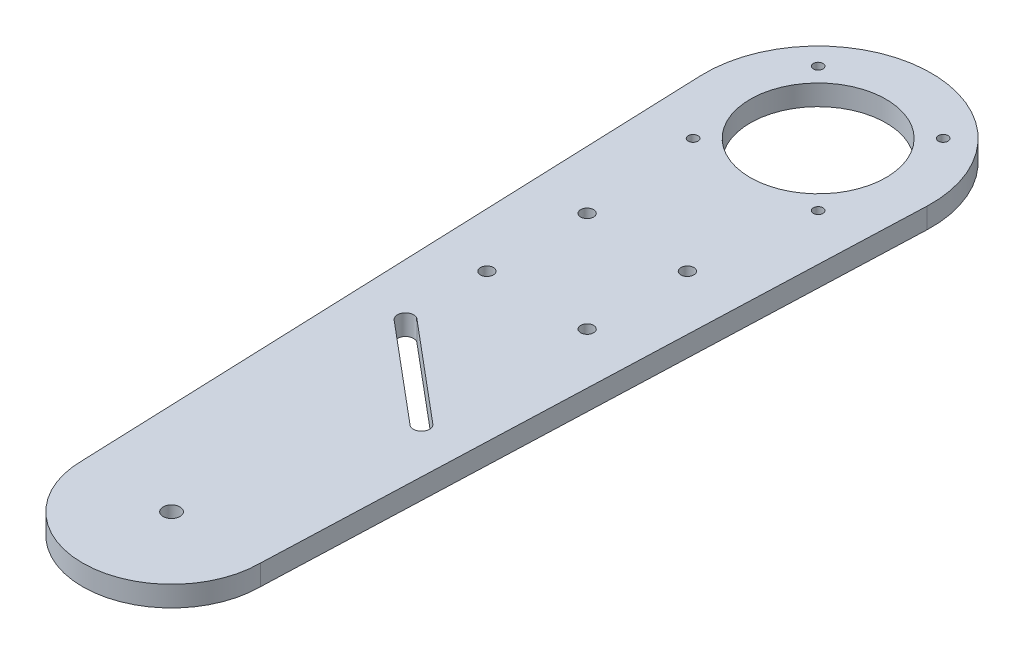
ISO-10303-21;
HEADER;
FILE_DESCRIPTION(('STEP AP214'),'2;1');
FILE_NAME('part.step','',(''),(''),'','','');
FILE_SCHEMA(('AUTOMOTIVE_DESIGN { 1 0 10303 214 1 1 1 1 }'));
ENDSEC;
DATA;
#1=APPLICATION_CONTEXT('core data for automotive mechanical design processes');
#2=APPLICATION_PROTOCOL_DEFINITION('international standard','automotive_design',2000,#1);
#3=PRODUCT_CONTEXT('',#1,'mechanical');
#4=PRODUCT('Part','Part','',(#3));
#5=PRODUCT_RELATED_PRODUCT_CATEGORY('part','',(#4));
#6=PRODUCT_DEFINITION_FORMATION('','',#4);
#7=PRODUCT_DEFINITION_CONTEXT('part definition',#1,'design');
#8=PRODUCT_DEFINITION('design','',#6,#7);
#9=PRODUCT_DEFINITION_SHAPE('','',#8);
#10=(LENGTH_UNIT() NAMED_UNIT(*) SI_UNIT(.MILLI.,.METRE.));
#11=(NAMED_UNIT(*) PLANE_ANGLE_UNIT() SI_UNIT($,.RADIAN.));
#12=(NAMED_UNIT(*) SI_UNIT($,.STERADIAN.) SOLID_ANGLE_UNIT());
#13=UNCERTAINTY_MEASURE_WITH_UNIT(LENGTH_MEASURE(1.E-05),#10,'distance_accuracy_value','');
#14=(GEOMETRIC_REPRESENTATION_CONTEXT(3) GLOBAL_UNCERTAINTY_ASSIGNED_CONTEXT((#13)) GLOBAL_UNIT_ASSIGNED_CONTEXT((#10,
#11,#12)) REPRESENTATION_CONTEXT('',''));
#15=CARTESIAN_POINT('',(0.,0.,0.));
#16=DIRECTION('',(0.,0.,1.));
#17=DIRECTION('',(1.,0.,0.));
#18=AXIS2_PLACEMENT_3D('',#15,#16,#17);
#19=CARTESIAN_POINT('',(27.4611273571522,6.35,1.03319242929476));
#20=DIRECTION('',(-0.999292974733131,0.,-0.0375972159741946));
#21=DIRECTION('',(-0.0375972159741946,0.,0.999292974733131));
#22=AXIS2_PLACEMENT_3D('',#19,#20,#21);
#23=PLANE('',#22);
#24=DIRECTION('',(0.0375972159741946,0.,-0.999292974733131));
#25=VECTOR('',#24,1.);
#26=CARTESIAN_POINT('',(27.4611273571522,0.,1.03319242929476));
#27=LINE('',#26,#25);
#28=CARTESIAN_POINT('',(27.5,0.,0.));
#29=VERTEX_POINT('',#28);
#30=CARTESIAN_POINT('',(34.9752541156596,0.,-198.684097440903));
#31=VERTEX_POINT('',#30);
#32=EDGE_CURVE('E175',#29,#31,#27,.T.);
#33=ORIENTED_EDGE('',*,*,#32,.T.);
#34=DIRECTION('',(0.,-1.,0.));
#35=VECTOR('',#34,1.);
#36=CARTESIAN_POINT('',(34.9752541156596,6.35,-198.684097440903));
#37=LINE('',#36,#35);
#38=CARTESIAN_POINT('',(34.9752541156596,6.35,-198.684097440903));
#39=VERTEX_POINT('',#38);
#40=EDGE_CURVE('E11',#39,#31,#37,.T.);
#41=ORIENTED_EDGE('',*,*,#40,.F.);
#42=DIRECTION('',(0.0375972159741946,0.,-0.999292974733131));
#43=VECTOR('',#42,1.);
#44=CARTESIAN_POINT('',(27.4611273571522,6.35,1.03319242929476));
#45=LINE('',#44,#43);
#46=CARTESIAN_POINT('',(27.5,6.35,0.));
#47=VERTEX_POINT('',#46);
#48=EDGE_CURVE('E178',#47,#39,#45,.T.);
#49=ORIENTED_EDGE('',*,*,#48,.F.);
#50=DIRECTION('',(0.,-1.,0.));
#51=VECTOR('',#50,1.);
#52=CARTESIAN_POINT('',(27.5,6.35,0.));
#53=LINE('',#52,#51);
#54=EDGE_CURVE('E189',#47,#29,#53,.T.);
#55=ORIENTED_EDGE('',*,*,#54,.T.);
#56=EDGE_LOOP('',(#33,#41,#49,#55));
#57=FACE_BOUND('',#56,.T.);
#58=ADVANCED_FACE('F37',(#57),#23,.F.);
#59=CARTESIAN_POINT('',(0.,6.35,-200.));
#60=DIRECTION('',(0.,-1.,0.));
#61=DIRECTION('',(0.,0.,-1.));
#62=AXIS2_PLACEMENT_3D('',#59,#60,#61);
#63=CYLINDRICAL_SURFACE('',#62,35.);
#64=CARTESIAN_POINT('',(0.,0.,-200.));
#65=DIRECTION('',(0.,1.,0.));
#66=DIRECTION('',(0.,0.,1.));
#67=AXIS2_PLACEMENT_3D('',#64,#65,#66);
#68=CIRCLE('',#67,35.);
#69=CARTESIAN_POINT('',(-34.9752541156596,0.,-198.684097440903));
#70=VERTEX_POINT('',#69);
#71=EDGE_CURVE('E192',#31,#70,#68,.T.);
#72=ORIENTED_EDGE('',*,*,#71,.T.);
#73=DIRECTION('',(0.,-1.,0.));
#74=VECTOR('',#73,1.);
#75=CARTESIAN_POINT('',(-34.9752541156596,6.35,-198.684097440903));
#76=LINE('',#75,#74);
#77=CARTESIAN_POINT('',(-34.9752541156596,6.35,-198.684097440903));
#78=VERTEX_POINT('',#77);
#79=EDGE_CURVE('E44',#78,#70,#76,.T.);
#80=ORIENTED_EDGE('',*,*,#79,.F.);
#81=CARTESIAN_POINT('',(0.,6.35,-200.));
#82=DIRECTION('',(0.,1.,0.));
#83=DIRECTION('',(0.,0.,1.));
#84=AXIS2_PLACEMENT_3D('',#81,#82,#83);
#85=CIRCLE('',#84,35.);
#86=EDGE_CURVE('E181',#39,#78,#85,.T.);
#87=ORIENTED_EDGE('',*,*,#86,.F.);
#88=ORIENTED_EDGE('',*,*,#40,.T.);
#89=EDGE_LOOP('',(#72,#80,#87,#88));
#90=FACE_BOUND('',#89,.T.);
#91=ADVANCED_FACE('F208',(#90),#63,.T.);
#92=CARTESIAN_POINT('',(-27.4611273571522,6.35,1.03319242929476));
#93=DIRECTION('',(-0.999292974733131,0.,0.0375972159741946));
#94=DIRECTION('',(0.0375972159741946,0.,0.999292974733131));
#95=AXIS2_PLACEMENT_3D('',#92,#93,#94);
#96=PLANE('',#95);
#97=DIRECTION('',(-0.0375972159741946,0.,-0.999292974733131));
#98=VECTOR('',#97,1.);
#99=CARTESIAN_POINT('',(-27.4611273571522,0.,1.03319242929476));
#100=LINE('',#99,#98);
#101=CARTESIAN_POINT('',(-27.5,0.,0.));
#102=VERTEX_POINT('',#101);
#103=EDGE_CURVE('E195',#102,#70,#100,.T.);
#104=ORIENTED_EDGE('',*,*,#103,.F.);
#105=DIRECTION('',(0.,-1.,0.));
#106=VECTOR('',#105,1.);
#107=CARTESIAN_POINT('',(-27.5,6.35,0.));
#108=LINE('',#107,#106);
#109=CARTESIAN_POINT('',(-27.5,6.35,0.));
#110=VERTEX_POINT('',#109);
#111=EDGE_CURVE('E201',#110,#102,#108,.T.);
#112=ORIENTED_EDGE('',*,*,#111,.F.);
#113=DIRECTION('',(-0.0375972159741946,0.,-0.999292974733131));
#114=VECTOR('',#113,1.);
#115=CARTESIAN_POINT('',(-27.4611273571522,6.35,1.03319242929476));
#116=LINE('',#115,#114);
#117=EDGE_CURVE('E184',#110,#78,#116,.T.);
#118=ORIENTED_EDGE('',*,*,#117,.T.);
#119=ORIENTED_EDGE('',*,*,#79,.T.);
#120=EDGE_LOOP('',(#104,#112,#118,#119));
#121=FACE_BOUND('',#120,.T.);
#122=ADVANCED_FACE('F205',(#121),#96,.T.);
#123=CARTESIAN_POINT('',(0.,6.35,0.));
#124=DIRECTION('',(0.,-1.,0.));
#125=DIRECTION('',(0.,0.,-1.));
#126=AXIS2_PLACEMENT_3D('',#123,#124,#125);
#127=CYLINDRICAL_SURFACE('',#126,27.5);
#128=CARTESIAN_POINT('',(0.,0.,0.));
#129=DIRECTION('',(0.,1.,0.));
#130=DIRECTION('',(0.,0.,1.));
#131=AXIS2_PLACEMENT_3D('',#128,#129,#130);
#132=CIRCLE('',#131,27.5);
#133=EDGE_CURVE('E182',#102,#29,#132,.T.);
#134=ORIENTED_EDGE('',*,*,#133,.T.);
#135=ORIENTED_EDGE('',*,*,#54,.F.);
#136=CARTESIAN_POINT('',(0.,6.35,0.));
#137=DIRECTION('',(0.,1.,0.));
#138=DIRECTION('',(0.,0.,1.));
#139=AXIS2_PLACEMENT_3D('',#136,#137,#138);
#140=CIRCLE('',#139,27.5);
#141=EDGE_CURVE('E187',#110,#47,#140,.T.);
#142=ORIENTED_EDGE('',*,*,#141,.F.);
#143=ORIENTED_EDGE('',*,*,#111,.T.);
#144=EDGE_LOOP('',(#134,#135,#142,#143));
#145=FACE_BOUND('',#144,.T.);
#146=ADVANCED_FACE('F215',(#145),#127,.T.);
#147=CARTESIAN_POINT('',(0.,6.35,0.));
#148=DIRECTION('',(0.,1.,0.));
#149=DIRECTION('',(0.,0.,1.));
#150=AXIS2_PLACEMENT_3D('',#147,#148,#149);
#151=PLANE('',#150);
#152=CARTESIAN_POINT('',(15.3500000000007,6.35,-144.2));
#153=DIRECTION('',(0.,1.,0.));
#154=DIRECTION('',(0.,0.,1.));
#155=AXIS2_PLACEMENT_3D('',#152,#153,#154);
#156=CIRCLE('',#155,2.);
#157=CARTESIAN_POINT('',(15.3500000000007,6.35,-142.2));
#158=VERTEX_POINT('',#157);
#159=EDGE_CURVE('E401',#158,#158,#156,.T.);
#160=ORIENTED_EDGE('',*,*,#159,.F.);
#161=EDGE_LOOP('',(#160));
#162=FACE_BOUND('',#161,.T.);
#163=CARTESIAN_POINT('',(15.3500000000007,6.35,-113.2));
#164=DIRECTION('',(0.,1.,0.));
#165=DIRECTION('',(0.,0.,1.));
#166=AXIS2_PLACEMENT_3D('',#163,#164,#165);
#167=CIRCLE('',#166,2.);
#168=CARTESIAN_POINT('',(15.3500000000007,6.35,-111.2));
#169=VERTEX_POINT('',#168);
#170=EDGE_CURVE('E403',#169,#169,#167,.T.);
#171=ORIENTED_EDGE('',*,*,#170,.F.);
#172=EDGE_LOOP('',(#171));
#173=FACE_BOUND('',#172,.T.);
#174=CARTESIAN_POINT('',(-15.6499999999993,6.35,-113.2));
#175=DIRECTION('',(0.,1.,0.));
#176=DIRECTION('',(0.,0.,1.));
#177=AXIS2_PLACEMENT_3D('',#174,#175,#176);
#178=CIRCLE('',#177,2.);
#179=CARTESIAN_POINT('',(-15.6499999999993,6.35,-111.2));
#180=VERTEX_POINT('',#179);
#181=EDGE_CURVE('E414',#180,#180,#178,.T.);
#182=ORIENTED_EDGE('',*,*,#181,.F.);
#183=EDGE_LOOP('',(#182));
#184=FACE_BOUND('',#183,.T.);
#185=CARTESIAN_POINT('',(-15.6499999999993,6.35,-144.2));
#186=DIRECTION('',(0.,1.,0.));
#187=DIRECTION('',(0.,0.,1.));
#188=AXIS2_PLACEMENT_3D('',#185,#186,#187);
#189=CIRCLE('',#188,2.);
#190=CARTESIAN_POINT('',(-15.6499999999993,6.35,-142.2));
#191=VERTEX_POINT('',#190);
#192=EDGE_CURVE('E125',#191,#191,#189,.T.);
#193=ORIENTED_EDGE('',*,*,#192,.F.);
#194=EDGE_LOOP('',(#193));
#195=FACE_BOUND('',#194,.T.);
#196=CARTESIAN_POINT('',(15.3208888623802,6.35,-61.9884956125381));
#197=DIRECTION('',(0.,1.,0.));
#198=DIRECTION('',(0.,0.,1.));
#199=AXIS2_PLACEMENT_3D('',#196,#197,#198);
#200=CIRCLE('',#199,2.50000000000001);
#201=CARTESIAN_POINT('',(13.7139198381638,6.35,-60.0733845047406));
#202=VERTEX_POINT('',#201);
#203=CARTESIAN_POINT('',(16.9278578865965,6.35,-63.9036067203355));
#204=VERTEX_POINT('',#203);
#205=EDGE_CURVE('E51',#202,#204,#200,.T.);
#206=ORIENTED_EDGE('',*,*,#205,.F.);
#207=DIRECTION('',(0.766044443118977,0.,0.642787609686541));
#208=VECTOR('',#207,1.);
#209=CARTESIAN_POINT('',(13.7139198381638,6.35,-60.0733845047406));
#210=LINE('',#209,#208);
#211=CARTESIAN_POINT('',(-16.9278578865952,6.35,-85.7848888922023));
#212=VERTEX_POINT('',#211);
#213=EDGE_CURVE('E119',#212,#202,#210,.T.);
#214=ORIENTED_EDGE('',*,*,#213,.F.);
#215=CARTESIAN_POINT('',(-15.3208888623789,6.35,-87.6999999999997));
#216=DIRECTION('',(0.,1.,0.));
#217=DIRECTION('',(0.,0.,1.));
#218=AXIS2_PLACEMENT_3D('',#215,#216,#217);
#219=CIRCLE('',#218,2.49999999999999);
#220=CARTESIAN_POINT('',(-13.7139198381626,6.35,-89.6151111077971));
#221=VERTEX_POINT('',#220);
#222=EDGE_CURVE('E122',#221,#212,#219,.T.);
#223=ORIENTED_EDGE('',*,*,#222,.F.);
#224=DIRECTION('',(-0.766044443118977,0.,-0.64278760968654));
#225=VECTOR('',#224,1.);
#226=CARTESIAN_POINT('',(16.9278578865965,6.35,-63.9036067203355));
#227=LINE('',#226,#225);
#228=EDGE_CURVE('E131',#204,#221,#227,.T.);
#229=ORIENTED_EDGE('',*,*,#228,.F.);
#230=EDGE_LOOP('',(#206,#214,#223,#229));
#231=FACE_BOUND('',#230,.T.);
#232=CARTESIAN_POINT('',(-19.3393704654521,6.35,-180.660629534548));
#233=DIRECTION('',(0.,1.,0.));
#234=DIRECTION('',(0.,0.,1.));
#235=AXIS2_PLACEMENT_3D('',#232,#233,#234);
#236=CIRCLE('',#235,1.5);
#237=CARTESIAN_POINT('',(-19.3393704654521,6.35,-179.160629534548));
#238=VERTEX_POINT('',#237);
#239=EDGE_CURVE('E138',#238,#238,#236,.T.);
#240=ORIENTED_EDGE('',*,*,#239,.F.);
#241=EDGE_LOOP('',(#240));
#242=FACE_BOUND('',#241,.T.);
#243=CARTESIAN_POINT('',(19.3393704654521,6.35,-180.660629534548));
#244=DIRECTION('',(0.,1.,0.));
#245=DIRECTION('',(0.,0.,1.));
#246=AXIS2_PLACEMENT_3D('',#243,#244,#245);
#247=CIRCLE('',#246,1.5);
#248=CARTESIAN_POINT('',(19.3393704654521,6.35,-179.160629534548));
#249=VERTEX_POINT('',#248);
#250=EDGE_CURVE('E152',#249,#249,#247,.T.);
#251=ORIENTED_EDGE('',*,*,#250,.F.);
#252=EDGE_LOOP('',(#251));
#253=FACE_BOUND('',#252,.T.);
#254=CARTESIAN_POINT('',(19.3393704654521,6.35,-219.339370465452));
#255=DIRECTION('',(0.,1.,0.));
#256=DIRECTION('',(0.,0.,1.));
#257=AXIS2_PLACEMENT_3D('',#254,#255,#256);
#258=CIRCLE('',#257,1.5);
#259=CARTESIAN_POINT('',(19.3393704654521,6.35,-217.839370465452));
#260=VERTEX_POINT('',#259);
#261=EDGE_CURVE('E146',#260,#260,#258,.T.);
#262=ORIENTED_EDGE('',*,*,#261,.F.);
#263=EDGE_LOOP('',(#262));
#264=FACE_BOUND('',#263,.T.);
#265=CARTESIAN_POINT('',(-19.3393704654521,6.35,-219.339370465452));
#266=DIRECTION('',(0.,1.,0.));
#267=DIRECTION('',(0.,0.,1.));
#268=AXIS2_PLACEMENT_3D('',#265,#266,#267);
#269=CIRCLE('',#268,1.5);
#270=CARTESIAN_POINT('',(-19.3393704654521,6.35,-217.839370465452));
#271=VERTEX_POINT('',#270);
#272=EDGE_CURVE('E145',#271,#271,#269,.T.);
#273=ORIENTED_EDGE('',*,*,#272,.F.);
#274=EDGE_LOOP('',(#273));
#275=FACE_BOUND('',#274,.T.);
#276=CARTESIAN_POINT('',(0.,6.35,-200.));
#277=DIRECTION('',(0.,1.,0.));
#278=DIRECTION('',(0.,0.,1.));
#279=AXIS2_PLACEMENT_3D('',#276,#277,#278);
#280=CIRCLE('',#279,21.);
#281=CARTESIAN_POINT('',(0.,6.35,-179.));
#282=VERTEX_POINT('',#281);
#283=EDGE_CURVE('E163',#282,#282,#280,.T.);
#284=ORIENTED_EDGE('',*,*,#283,.F.);
#285=EDGE_LOOP('',(#284));
#286=FACE_BOUND('',#285,.T.);
#287=CARTESIAN_POINT('',(0.,6.35,0.));
#288=DIRECTION('',(0.,1.,0.));
#289=DIRECTION('',(0.,0.,1.));
#290=AXIS2_PLACEMENT_3D('',#287,#288,#289);
#291=CIRCLE('',#290,2.6);
#292=CARTESIAN_POINT('',(0.,6.35,2.6));
#293=VERTEX_POINT('',#292);
#294=EDGE_CURVE('E169',#293,#293,#291,.T.);
#295=ORIENTED_EDGE('',*,*,#294,.F.);
#296=EDGE_LOOP('',(#295));
#297=FACE_BOUND('',#296,.T.);
#298=ORIENTED_EDGE('',*,*,#48,.T.);
#299=ORIENTED_EDGE('',*,*,#86,.T.);
#300=ORIENTED_EDGE('',*,*,#117,.F.);
#301=ORIENTED_EDGE('',*,*,#141,.T.);
#302=EDGE_LOOP('',(#298,#299,#300,#301));
#303=FACE_BOUND('',#302,.T.);
#304=ADVANCED_FACE('F220',(#162,#173,#184,#195,#231,#242,#253,#264,#275,#286,#297,#303),#151,.T.);
#305=CARTESIAN_POINT('',(0.,0.,0.));
#306=DIRECTION('',(0.,1.,0.));
#307=DIRECTION('',(0.,0.,1.));
#308=AXIS2_PLACEMENT_3D('',#305,#306,#307);
#309=PLANE('',#308);
#310=CARTESIAN_POINT('',(15.3500000000007,0.,-144.2));
#311=DIRECTION('',(0.,1.,0.));
#312=DIRECTION('',(0.,0.,1.));
#313=AXIS2_PLACEMENT_3D('',#310,#311,#312);
#314=CIRCLE('',#313,2.);
#315=CARTESIAN_POINT('',(15.3500000000007,0.,-142.2));
#316=VERTEX_POINT('',#315);
#317=EDGE_CURVE('E399',#316,#316,#314,.T.);
#318=ORIENTED_EDGE('',*,*,#317,.T.);
#319=EDGE_LOOP('',(#318));
#320=FACE_BOUND('',#319,.T.);
#321=CARTESIAN_POINT('',(15.3500000000007,0.,-113.2));
#322=DIRECTION('',(0.,1.,0.));
#323=DIRECTION('',(0.,0.,1.));
#324=AXIS2_PLACEMENT_3D('',#321,#322,#323);
#325=CIRCLE('',#324,2.);
#326=CARTESIAN_POINT('',(15.3500000000007,0.,-111.2));
#327=VERTEX_POINT('',#326);
#328=EDGE_CURVE('E419',#327,#327,#325,.T.);
#329=ORIENTED_EDGE('',*,*,#328,.T.);
#330=EDGE_LOOP('',(#329));
#331=FACE_BOUND('',#330,.T.);
#332=CARTESIAN_POINT('',(-15.6499999999993,0.,-113.2));
#333=DIRECTION('',(0.,1.,0.));
#334=DIRECTION('',(0.,0.,1.));
#335=AXIS2_PLACEMENT_3D('',#332,#333,#334);
#336=CIRCLE('',#335,2.);
#337=CARTESIAN_POINT('',(-15.6499999999993,0.,-111.2));
#338=VERTEX_POINT('',#337);
#339=EDGE_CURVE('E410',#338,#338,#336,.T.);
#340=ORIENTED_EDGE('',*,*,#339,.T.);
#341=EDGE_LOOP('',(#340));
#342=FACE_BOUND('',#341,.T.);
#343=CARTESIAN_POINT('',(-15.6499999999993,0.,-144.2));
#344=DIRECTION('',(0.,1.,0.));
#345=DIRECTION('',(0.,0.,1.));
#346=AXIS2_PLACEMENT_3D('',#343,#344,#345);
#347=CIRCLE('',#346,2.);
#348=CARTESIAN_POINT('',(-15.6499999999993,0.,-142.2));
#349=VERTEX_POINT('',#348);
#350=EDGE_CURVE('E132',#349,#349,#347,.T.);
#351=ORIENTED_EDGE('',*,*,#350,.T.);
#352=EDGE_LOOP('',(#351));
#353=FACE_BOUND('',#352,.T.);
#354=DIRECTION('',(0.766044443118977,0.,0.642787609686541));
#355=VECTOR('',#354,1.);
#356=CARTESIAN_POINT('',(13.7139198381638,0.,-60.0733845047406));
#357=LINE('',#356,#355);
#358=CARTESIAN_POINT('',(-16.9278578865952,0.,-85.7848888922023));
#359=VERTEX_POINT('',#358);
#360=CARTESIAN_POINT('',(13.7139198381638,0.,-60.0733845047406));
#361=VERTEX_POINT('',#360);
#362=EDGE_CURVE('E109',#359,#361,#357,.T.);
#363=ORIENTED_EDGE('',*,*,#362,.T.);
#364=CARTESIAN_POINT('',(15.3208888623802,0.,-61.9884956125381));
#365=DIRECTION('',(0.,1.,0.));
#366=DIRECTION('',(0.,0.,1.));
#367=AXIS2_PLACEMENT_3D('',#364,#365,#366);
#368=CIRCLE('',#367,2.50000000000001);
#369=CARTESIAN_POINT('',(16.9278578865965,0.,-63.9036067203355));
#370=VERTEX_POINT('',#369);
#371=EDGE_CURVE('E103',#361,#370,#368,.T.);
#372=ORIENTED_EDGE('',*,*,#371,.T.);
#373=DIRECTION('',(-0.766044443118977,0.,-0.64278760968654));
#374=VECTOR('',#373,1.);
#375=CARTESIAN_POINT('',(16.9278578865965,0.,-63.9036067203355));
#376=LINE('',#375,#374);
#377=CARTESIAN_POINT('',(-13.7139198381626,0.,-89.6151111077971));
#378=VERTEX_POINT('',#377);
#379=EDGE_CURVE('E112',#370,#378,#376,.T.);
#380=ORIENTED_EDGE('',*,*,#379,.T.);
#381=CARTESIAN_POINT('',(-15.3208888623789,0.,-87.6999999999997));
#382=DIRECTION('',(0.,1.,0.));
#383=DIRECTION('',(0.,0.,1.));
#384=AXIS2_PLACEMENT_3D('',#381,#382,#383);
#385=CIRCLE('',#384,2.49999999999999);
#386=EDGE_CURVE('E59',#378,#359,#385,.T.);
#387=ORIENTED_EDGE('',*,*,#386,.T.);
#388=EDGE_LOOP('',(#363,#372,#380,#387));
#389=FACE_BOUND('',#388,.T.);
#390=CARTESIAN_POINT('',(-19.3393704654521,0.,-180.660629534548));
#391=DIRECTION('',(0.,1.,0.));
#392=DIRECTION('',(0.,0.,1.));
#393=AXIS2_PLACEMENT_3D('',#390,#391,#392);
#394=CIRCLE('',#393,1.5);
#395=CARTESIAN_POINT('',(-19.3393704654521,0.,-179.160629534548));
#396=VERTEX_POINT('',#395);
#397=EDGE_CURVE('E155',#396,#396,#394,.T.);
#398=ORIENTED_EDGE('',*,*,#397,.T.);
#399=EDGE_LOOP('',(#398));
#400=FACE_BOUND('',#399,.T.);
#401=CARTESIAN_POINT('',(19.3393704654521,0.,-180.660629534548));
#402=DIRECTION('',(0.,1.,0.));
#403=DIRECTION('',(0.,0.,1.));
#404=AXIS2_PLACEMENT_3D('',#401,#402,#403);
#405=CIRCLE('',#404,1.5);
#406=CARTESIAN_POINT('',(19.3393704654521,0.,-179.160629534548));
#407=VERTEX_POINT('',#406);
#408=EDGE_CURVE('E149',#407,#407,#405,.T.);
#409=ORIENTED_EDGE('',*,*,#408,.T.);
#410=EDGE_LOOP('',(#409));
#411=FACE_BOUND('',#410,.T.);
#412=CARTESIAN_POINT('',(19.3393704654521,0.,-219.339370465452));
#413=DIRECTION('',(0.,1.,0.));
#414=DIRECTION('',(0.,0.,1.));
#415=AXIS2_PLACEMENT_3D('',#412,#413,#414);
#416=CIRCLE('',#415,1.5);
#417=CARTESIAN_POINT('',(19.3393704654521,0.,-217.839370465452));
#418=VERTEX_POINT('',#417);
#419=EDGE_CURVE('E142',#418,#418,#416,.T.);
#420=ORIENTED_EDGE('',*,*,#419,.T.);
#421=EDGE_LOOP('',(#420));
#422=FACE_BOUND('',#421,.T.);
#423=CARTESIAN_POINT('',(-19.3393704654521,0.,-219.339370465452));
#424=DIRECTION('',(0.,1.,0.));
#425=DIRECTION('',(0.,0.,1.));
#426=AXIS2_PLACEMENT_3D('',#423,#424,#425);
#427=CIRCLE('',#426,1.5);
#428=CARTESIAN_POINT('',(-19.3393704654521,0.,-217.839370465452));
#429=VERTEX_POINT('',#428);
#430=EDGE_CURVE('E160',#429,#429,#427,.T.);
#431=ORIENTED_EDGE('',*,*,#430,.T.);
#432=EDGE_LOOP('',(#431));
#433=FACE_BOUND('',#432,.T.);
#434=CARTESIAN_POINT('',(0.,0.,-200.));
#435=DIRECTION('',(0.,1.,0.));
#436=DIRECTION('',(0.,0.,1.));
#437=AXIS2_PLACEMENT_3D('',#434,#435,#436);
#438=CIRCLE('',#437,21.);
#439=CARTESIAN_POINT('',(0.,0.,-179.));
#440=VERTEX_POINT('',#439);
#441=EDGE_CURVE('E166',#440,#440,#438,.T.);
#442=ORIENTED_EDGE('',*,*,#441,.T.);
#443=EDGE_LOOP('',(#442));
#444=FACE_BOUND('',#443,.T.);
#445=CARTESIAN_POINT('',(0.,0.,0.));
#446=DIRECTION('',(0.,1.,0.));
#447=DIRECTION('',(0.,0.,1.));
#448=AXIS2_PLACEMENT_3D('',#445,#446,#447);
#449=CIRCLE('',#448,2.6);
#450=CARTESIAN_POINT('',(0.,0.,2.6));
#451=VERTEX_POINT('',#450);
#452=EDGE_CURVE('E172',#451,#451,#449,.T.);
#453=ORIENTED_EDGE('',*,*,#452,.T.);
#454=EDGE_LOOP('',(#453));
#455=FACE_BOUND('',#454,.T.);
#456=ORIENTED_EDGE('',*,*,#32,.F.);
#457=ORIENTED_EDGE('',*,*,#133,.F.);
#458=ORIENTED_EDGE('',*,*,#103,.T.);
#459=ORIENTED_EDGE('',*,*,#71,.F.);
#460=EDGE_LOOP('',(#456,#457,#458,#459));
#461=FACE_BOUND('',#460,.T.);
#462=ADVANCED_FACE('F116',(#320,#331,#342,#353,#389,#400,#411,#422,#433,#444,#455,#461),#309,.F.);
#463=CARTESIAN_POINT('',(0.,0.,0.));
#464=DIRECTION('',(0.,1.,0.));
#465=DIRECTION('',(0.,0.,1.));
#466=AXIS2_PLACEMENT_3D('',#463,#464,#465);
#467=CYLINDRICAL_SURFACE('',#466,2.6);
#468=ORIENTED_EDGE('',*,*,#452,.F.);
#469=EDGE_LOOP('',(#468));
#470=FACE_BOUND('',#469,.T.);
#471=ORIENTED_EDGE('',*,*,#294,.T.);
#472=EDGE_LOOP('',(#471));
#473=FACE_BOUND('',#472,.T.);
#474=ADVANCED_FACE('F228',(#470,#473),#467,.F.);
#475=CARTESIAN_POINT('',(0.,0.,-200.));
#476=DIRECTION('',(0.,1.,0.));
#477=DIRECTION('',(0.,0.,1.));
#478=AXIS2_PLACEMENT_3D('',#475,#476,#477);
#479=CYLINDRICAL_SURFACE('',#478,21.);
#480=ORIENTED_EDGE('',*,*,#441,.F.);
#481=EDGE_LOOP('',(#480));
#482=FACE_BOUND('',#481,.T.);
#483=ORIENTED_EDGE('',*,*,#283,.T.);
#484=EDGE_LOOP('',(#483));
#485=FACE_BOUND('',#484,.T.);
#486=ADVANCED_FACE('F259',(#482,#485),#479,.F.);
#487=CARTESIAN_POINT('',(-19.3393704654521,0.,-219.339370465452));
#488=DIRECTION('',(0.,1.,0.));
#489=DIRECTION('',(0.,0.,1.));
#490=AXIS2_PLACEMENT_3D('',#487,#488,#489);
#491=CYLINDRICAL_SURFACE('',#490,1.5);
#492=ORIENTED_EDGE('',*,*,#430,.F.);
#493=EDGE_LOOP('',(#492));
#494=FACE_BOUND('',#493,.T.);
#495=ORIENTED_EDGE('',*,*,#272,.T.);
#496=EDGE_LOOP('',(#495));
#497=FACE_BOUND('',#496,.T.);
#498=ADVANCED_FACE('F269',(#494,#497),#491,.F.);
#499=CARTESIAN_POINT('',(19.3393704654521,0.,-219.339370465452));
#500=DIRECTION('',(0.,1.,0.));
#501=DIRECTION('',(0.,0.,1.));
#502=AXIS2_PLACEMENT_3D('',#499,#500,#501);
#503=CYLINDRICAL_SURFACE('',#502,1.5);
#504=ORIENTED_EDGE('',*,*,#419,.F.);
#505=EDGE_LOOP('',(#504));
#506=FACE_BOUND('',#505,.T.);
#507=ORIENTED_EDGE('',*,*,#261,.T.);
#508=EDGE_LOOP('',(#507));
#509=FACE_BOUND('',#508,.T.);
#510=ADVANCED_FACE('F279',(#506,#509),#503,.F.);
#511=CARTESIAN_POINT('',(19.3393704654521,0.,-180.660629534548));
#512=DIRECTION('',(0.,1.,0.));
#513=DIRECTION('',(0.,0.,1.));
#514=AXIS2_PLACEMENT_3D('',#511,#512,#513);
#515=CYLINDRICAL_SURFACE('',#514,1.5);
#516=ORIENTED_EDGE('',*,*,#408,.F.);
#517=EDGE_LOOP('',(#516));
#518=FACE_BOUND('',#517,.T.);
#519=ORIENTED_EDGE('',*,*,#250,.T.);
#520=EDGE_LOOP('',(#519));
#521=FACE_BOUND('',#520,.T.);
#522=ADVANCED_FACE('F289',(#518,#521),#515,.F.);
#523=CARTESIAN_POINT('',(-19.3393704654521,0.,-180.660629534548));
#524=DIRECTION('',(0.,1.,0.));
#525=DIRECTION('',(0.,0.,1.));
#526=AXIS2_PLACEMENT_3D('',#523,#524,#525);
#527=CYLINDRICAL_SURFACE('',#526,1.5);
#528=ORIENTED_EDGE('',*,*,#397,.F.);
#529=EDGE_LOOP('',(#528));
#530=FACE_BOUND('',#529,.T.);
#531=ORIENTED_EDGE('',*,*,#239,.T.);
#532=EDGE_LOOP('',(#531));
#533=FACE_BOUND('',#532,.T.);
#534=ADVANCED_FACE('F299',(#530,#533),#527,.F.);
#535=CARTESIAN_POINT('',(15.3208888623802,0.,-61.9884956125381));
#536=DIRECTION('',(0.,1.,0.));
#537=DIRECTION('',(0.,0.,1.));
#538=AXIS2_PLACEMENT_3D('',#535,#536,#537);
#539=CYLINDRICAL_SURFACE('',#538,2.50000000000001);
#540=ORIENTED_EDGE('',*,*,#205,.T.);
#541=DIRECTION('',(0.,1.,0.));
#542=VECTOR('',#541,1.);
#543=CARTESIAN_POINT('',(16.9278578865965,0.,-63.9036067203355));
#544=LINE('',#543,#542);
#545=EDGE_CURVE('E99',#370,#204,#544,.T.);
#546=ORIENTED_EDGE('',*,*,#545,.F.);
#547=ORIENTED_EDGE('',*,*,#371,.F.);
#548=DIRECTION('',(0.,1.,0.));
#549=VECTOR('',#548,1.);
#550=CARTESIAN_POINT('',(13.7139198381638,0.,-60.0733845047406));
#551=LINE('',#550,#549);
#552=EDGE_CURVE('E136',#361,#202,#551,.T.);
#553=ORIENTED_EDGE('',*,*,#552,.T.);
#554=EDGE_LOOP('',(#540,#546,#547,#553));
#555=FACE_BOUND('',#554,.T.);
#556=ADVANCED_FACE('F101',(#555),#539,.F.);
#557=CARTESIAN_POINT('',(13.7139198381638,0.,-60.0733845047406));
#558=DIRECTION('',(-0.642787609686541,0.,0.766044443118977));
#559=DIRECTION('',(0.766044443118977,0.,0.642787609686541));
#560=AXIS2_PLACEMENT_3D('',#557,#558,#559);
#561=PLANE('',#560);
#562=ORIENTED_EDGE('',*,*,#213,.T.);
#563=ORIENTED_EDGE('',*,*,#552,.F.);
#564=ORIENTED_EDGE('',*,*,#362,.F.);
#565=DIRECTION('',(0.,1.,0.));
#566=VECTOR('',#565,1.);
#567=CARTESIAN_POINT('',(-16.9278578865952,0.,-85.7848888922023));
#568=LINE('',#567,#566);
#569=EDGE_CURVE('E139',#359,#212,#568,.T.);
#570=ORIENTED_EDGE('',*,*,#569,.T.);
#571=EDGE_LOOP('',(#562,#563,#564,#570));
#572=FACE_BOUND('',#571,.T.);
#573=ADVANCED_FACE('F318',(#572),#561,.F.);
#574=CARTESIAN_POINT('',(-15.3208888623789,0.,-87.6999999999997));
#575=DIRECTION('',(0.,1.,0.));
#576=DIRECTION('',(0.,0.,1.));
#577=AXIS2_PLACEMENT_3D('',#574,#575,#576);
#578=CYLINDRICAL_SURFACE('',#577,2.49999999999999);
#579=ORIENTED_EDGE('',*,*,#222,.T.);
#580=ORIENTED_EDGE('',*,*,#569,.F.);
#581=ORIENTED_EDGE('',*,*,#386,.F.);
#582=DIRECTION('',(0.,1.,0.));
#583=VECTOR('',#582,1.);
#584=CARTESIAN_POINT('',(-13.7139198381626,0.,-89.6151111077971));
#585=LINE('',#584,#583);
#586=EDGE_CURVE('E108',#378,#221,#585,.T.);
#587=ORIENTED_EDGE('',*,*,#586,.T.);
#588=EDGE_LOOP('',(#579,#580,#581,#587));
#589=FACE_BOUND('',#588,.T.);
#590=ADVANCED_FACE('F327',(#589),#578,.F.);
#591=CARTESIAN_POINT('',(16.9278578865965,0.,-63.9036067203355));
#592=DIRECTION('',(0.64278760968654,0.,-0.766044443118977));
#593=DIRECTION('',(-0.766044443118977,0.,-0.64278760968654));
#594=AXIS2_PLACEMENT_3D('',#591,#592,#593);
#595=PLANE('',#594);
#596=ORIENTED_EDGE('',*,*,#228,.T.);
#597=ORIENTED_EDGE('',*,*,#586,.F.);
#598=ORIENTED_EDGE('',*,*,#379,.F.);
#599=ORIENTED_EDGE('',*,*,#545,.T.);
#600=EDGE_LOOP('',(#596,#597,#598,#599));
#601=FACE_BOUND('',#600,.T.);
#602=ADVANCED_FACE('F113',(#601),#595,.F.);
#603=CARTESIAN_POINT('',(-15.6499999999993,0.,-144.2));
#604=DIRECTION('',(0.,1.,0.));
#605=DIRECTION('',(0.,0.,1.));
#606=AXIS2_PLACEMENT_3D('',#603,#604,#605);
#607=CYLINDRICAL_SURFACE('',#606,2.);
#608=ORIENTED_EDGE('',*,*,#350,.F.);
#609=EDGE_LOOP('',(#608));
#610=FACE_BOUND('',#609,.T.);
#611=ORIENTED_EDGE('',*,*,#192,.T.);
#612=EDGE_LOOP('',(#611));
#613=FACE_BOUND('',#612,.T.);
#614=ADVANCED_FACE('F344',(#610,#613),#607,.F.);
#615=CARTESIAN_POINT('',(-15.6499999999993,0.,-113.2));
#616=DIRECTION('',(0.,1.,0.));
#617=DIRECTION('',(0.,0.,1.));
#618=AXIS2_PLACEMENT_3D('',#615,#616,#617);
#619=CYLINDRICAL_SURFACE('',#618,2.);
#620=ORIENTED_EDGE('',*,*,#339,.F.);
#621=EDGE_LOOP('',(#620));
#622=FACE_BOUND('',#621,.T.);
#623=ORIENTED_EDGE('',*,*,#181,.T.);
#624=EDGE_LOOP('',(#623));
#625=FACE_BOUND('',#624,.T.);
#626=ADVANCED_FACE('F362',(#622,#625),#619,.F.);
#627=CARTESIAN_POINT('',(15.3500000000007,0.,-113.2));
#628=DIRECTION('',(0.,1.,0.));
#629=DIRECTION('',(0.,0.,1.));
#630=AXIS2_PLACEMENT_3D('',#627,#628,#629);
#631=CYLINDRICAL_SURFACE('',#630,2.);
#632=ORIENTED_EDGE('',*,*,#328,.F.);
#633=EDGE_LOOP('',(#632));
#634=FACE_BOUND('',#633,.T.);
#635=ORIENTED_EDGE('',*,*,#170,.T.);
#636=EDGE_LOOP('',(#635));
#637=FACE_BOUND('',#636,.T.);
#638=ADVANCED_FACE('F372',(#634,#637),#631,.F.);
#639=CARTESIAN_POINT('',(15.3500000000007,0.,-144.2));
#640=DIRECTION('',(0.,1.,0.));
#641=DIRECTION('',(0.,0.,1.));
#642=AXIS2_PLACEMENT_3D('',#639,#640,#641);
#643=CYLINDRICAL_SURFACE('',#642,2.);
#644=ORIENTED_EDGE('',*,*,#317,.F.);
#645=EDGE_LOOP('',(#644));
#646=FACE_BOUND('',#645,.T.);
#647=ORIENTED_EDGE('',*,*,#159,.T.);
#648=EDGE_LOOP('',(#647));
#649=FACE_BOUND('',#648,.T.);
#650=ADVANCED_FACE('F382',(#646,#649),#643,.F.);
#651=CLOSED_SHELL('',(#58,#91,#122,#146,#304,#462,#474,#486,#498,#510,#522,#534,#556,#573,#590,
#602,#614,#626,#638,#650));
#652=MANIFOLD_SOLID_BREP('B2',#651);
#653=ADVANCED_BREP_SHAPE_REPRESENTATION('',(#18,#652),#14);
#654=SHAPE_DEFINITION_REPRESENTATION(#9,#653);
ENDSEC;
END-ISO-10303-21;
